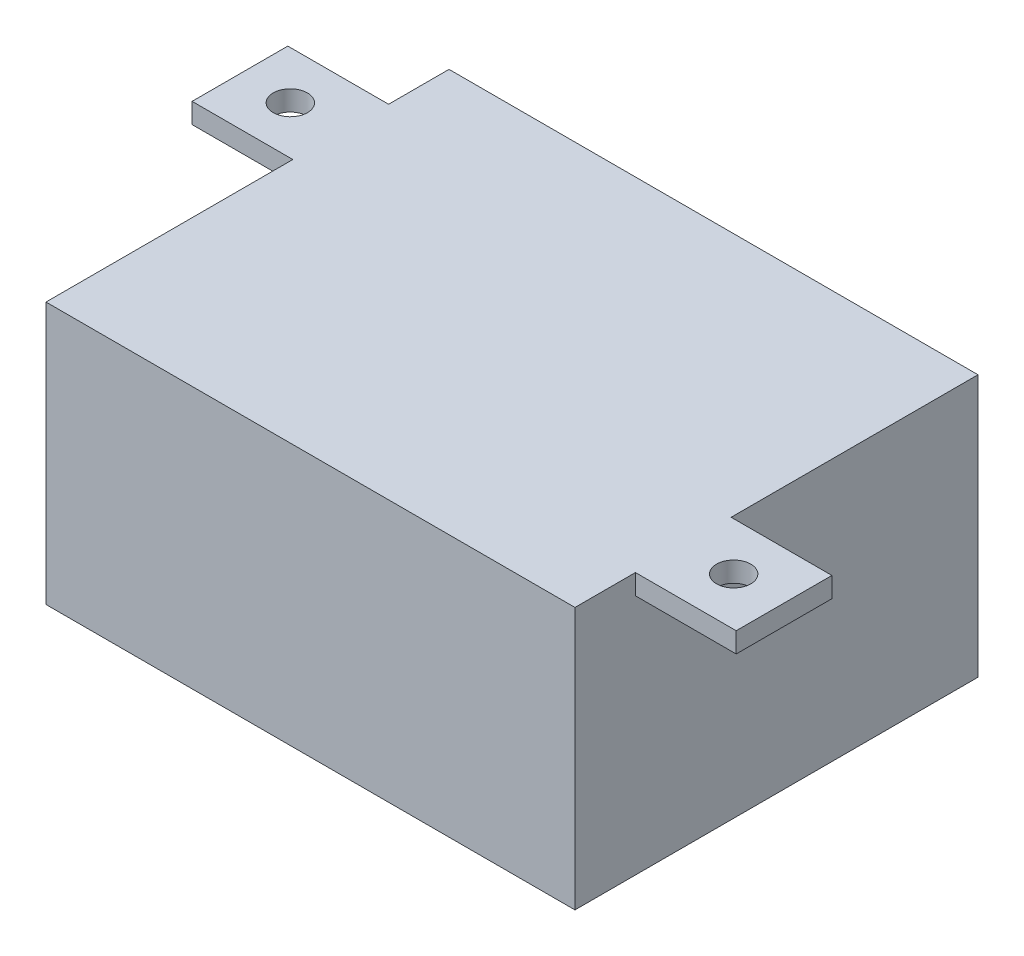
ISO-10303-21;
HEADER;
FILE_DESCRIPTION(('STEP AP214'),'2;1');
FILE_NAME('part.step','',(''),(''),'','','');
FILE_SCHEMA(('AUTOMOTIVE_DESIGN { 1 0 10303 214 1 1 1 1 }'));
ENDSEC;
DATA;
#1=APPLICATION_CONTEXT('core data for automotive mechanical design processes');
#2=APPLICATION_PROTOCOL_DEFINITION('international standard','automotive_design',2000,#1);
#3=PRODUCT_CONTEXT('',#1,'mechanical');
#4=PRODUCT('Part','Part','',(#3));
#5=PRODUCT_RELATED_PRODUCT_CATEGORY('part','',(#4));
#6=PRODUCT_DEFINITION_FORMATION('','',#4);
#7=PRODUCT_DEFINITION_CONTEXT('part definition',#1,'design');
#8=PRODUCT_DEFINITION('design','',#6,#7);
#9=PRODUCT_DEFINITION_SHAPE('','',#8);
#10=(LENGTH_UNIT() NAMED_UNIT(*) SI_UNIT(.MILLI.,.METRE.));
#11=(NAMED_UNIT(*) PLANE_ANGLE_UNIT() SI_UNIT($,.RADIAN.));
#12=(NAMED_UNIT(*) SI_UNIT($,.STERADIAN.) SOLID_ANGLE_UNIT());
#13=UNCERTAINTY_MEASURE_WITH_UNIT(LENGTH_MEASURE(1.E-05),#10,'distance_accuracy_value','');
#14=(GEOMETRIC_REPRESENTATION_CONTEXT(3) GLOBAL_UNCERTAINTY_ASSIGNED_CONTEXT((#13)) GLOBAL_UNIT_ASSIGNED_CONTEXT((#10,
#11,#12)) REPRESENTATION_CONTEXT('',''));
#15=CARTESIAN_POINT('',(0.,0.,0.));
#16=DIRECTION('',(0.,0.,1.));
#17=DIRECTION('',(1.,0.,0.));
#18=AXIS2_PLACEMENT_3D('',#15,#16,#17);
#19=CARTESIAN_POINT('',(-26.25,92.57,20.));
#20=DIRECTION('',(1.,0.,0.));
#21=DIRECTION('',(0.,0.,-1.));
#22=AXIS2_PLACEMENT_3D('',#19,#20,#21);
#23=PLANE('',#22);
#24=DIRECTION('',(0.,-1.,0.));
#25=VECTOR('',#24,1.);
#26=CARTESIAN_POINT('',(-26.25,92.57,-14.));
#27=LINE('',#26,#25);
#28=CARTESIAN_POINT('',(-26.25,92.57,-14.));
#29=VERTEX_POINT('',#28);
#30=CARTESIAN_POINT('',(-26.25,90.57,-14.));
#31=VERTEX_POINT('',#30);
#32=EDGE_CURVE('E193',#29,#31,#27,.T.);
#33=ORIENTED_EDGE('',*,*,#32,.F.);
#34=DIRECTION('',(0.,0.,1.));
#35=VECTOR('',#34,1.);
#36=CARTESIAN_POINT('',(-26.25,92.57,20.));
#37=LINE('',#36,#35);
#38=CARTESIAN_POINT('',(-26.25,92.57,-20.));
#39=VERTEX_POINT('',#38);
#40=EDGE_CURVE('E194',#39,#29,#37,.T.);
#41=ORIENTED_EDGE('',*,*,#40,.F.);
#42=DIRECTION('',(0.,-1.,0.));
#43=VECTOR('',#42,1.);
#44=CARTESIAN_POINT('',(-26.25,92.57,-20.));
#45=LINE('',#44,#43);
#46=CARTESIAN_POINT('',(-26.25,66.57,-20.));
#47=VERTEX_POINT('',#46);
#48=EDGE_CURVE('E159',#39,#47,#45,.T.);
#49=ORIENTED_EDGE('',*,*,#48,.T.);
#50=DIRECTION('',(0.,0.,1.));
#51=VECTOR('',#50,1.);
#52=CARTESIAN_POINT('',(-26.25,66.57,20.));
#53=LINE('',#52,#51);
#54=CARTESIAN_POINT('',(-26.25,66.57,20.));
#55=VERTEX_POINT('',#54);
#56=EDGE_CURVE('E149',#47,#55,#53,.T.);
#57=ORIENTED_EDGE('',*,*,#56,.T.);
#58=DIRECTION('',(0.,-1.,0.));
#59=VECTOR('',#58,1.);
#60=CARTESIAN_POINT('',(-26.25,92.57,20.));
#61=LINE('',#60,#59);
#62=CARTESIAN_POINT('',(-26.25,92.57,20.));
#63=VERTEX_POINT('',#62);
#64=EDGE_CURVE('E11',#63,#55,#61,.T.);
#65=ORIENTED_EDGE('',*,*,#64,.F.);
#66=CARTESIAN_POINT('',(-26.25,92.57,-4.5));
#67=VERTEX_POINT('',#66);
#68=EDGE_CURVE('E175',#67,#63,#37,.T.);
#69=ORIENTED_EDGE('',*,*,#68,.F.);
#70=DIRECTION('',(0.,-1.,0.));
#71=VECTOR('',#70,1.);
#72=CARTESIAN_POINT('',(-26.25,92.57,-4.5));
#73=LINE('',#72,#71);
#74=CARTESIAN_POINT('',(-26.25,90.57,-4.5));
#75=VERTEX_POINT('',#74);
#76=EDGE_CURVE('E225',#67,#75,#73,.T.);
#77=ORIENTED_EDGE('',*,*,#76,.T.);
#78=DIRECTION('',(0.,0.,-1.));
#79=VECTOR('',#78,1.);
#80=CARTESIAN_POINT('',(-26.25,90.57,-14.));
#81=LINE('',#80,#79);
#82=EDGE_CURVE('E54',#75,#31,#81,.T.);
#83=ORIENTED_EDGE('',*,*,#82,.T.);
#84=EDGE_LOOP('',(#33,#41,#49,#57,#65,#69,#77,#83));
#85=FACE_BOUND('',#84,.T.);
#86=ADVANCED_FACE('F41',(#85),#23,.F.);
#87=CARTESIAN_POINT('',(26.25,92.57,-20.));
#88=DIRECTION('',(-1.,0.,0.));
#89=DIRECTION('',(0.,0.,1.));
#90=AXIS2_PLACEMENT_3D('',#87,#88,#89);
#91=PLANE('',#90);
#92=DIRECTION('',(0.,-1.,0.));
#93=VECTOR('',#92,1.);
#94=CARTESIAN_POINT('',(26.25,92.57,14.));
#95=LINE('',#94,#93);
#96=CARTESIAN_POINT('',(26.25,92.57,14.));
#97=VERTEX_POINT('',#96);
#98=CARTESIAN_POINT('',(26.25,90.57,14.));
#99=VERTEX_POINT('',#98);
#100=EDGE_CURVE('E133',#97,#99,#95,.T.);
#101=ORIENTED_EDGE('',*,*,#100,.F.);
#102=DIRECTION('',(0.,0.,-1.));
#103=VECTOR('',#102,1.);
#104=CARTESIAN_POINT('',(26.25,92.57,-20.));
#105=LINE('',#104,#103);
#106=CARTESIAN_POINT('',(26.25,92.57,20.));
#107=VERTEX_POINT('',#106);
#108=EDGE_CURVE('E150',#107,#97,#105,.T.);
#109=ORIENTED_EDGE('',*,*,#108,.F.);
#110=DIRECTION('',(0.,-1.,0.));
#111=VECTOR('',#110,1.);
#112=CARTESIAN_POINT('',(26.25,92.57,20.));
#113=LINE('',#112,#111);
#114=CARTESIAN_POINT('',(26.25,66.57,20.));
#115=VERTEX_POINT('',#114);
#116=EDGE_CURVE('E48',#107,#115,#113,.T.);
#117=ORIENTED_EDGE('',*,*,#116,.T.);
#118=DIRECTION('',(0.,0.,-1.));
#119=VECTOR('',#118,1.);
#120=CARTESIAN_POINT('',(26.25,66.57,-20.));
#121=LINE('',#120,#119);
#122=CARTESIAN_POINT('',(26.25,66.57,-20.));
#123=VERTEX_POINT('',#122);
#124=EDGE_CURVE('E166',#115,#123,#121,.T.);
#125=ORIENTED_EDGE('',*,*,#124,.T.);
#126=DIRECTION('',(0.,-1.,0.));
#127=VECTOR('',#126,1.);
#128=CARTESIAN_POINT('',(26.25,92.57,-20.));
#129=LINE('',#128,#127);
#130=CARTESIAN_POINT('',(26.25,92.57,-20.));
#131=VERTEX_POINT('',#130);
#132=EDGE_CURVE('E176',#131,#123,#129,.T.);
#133=ORIENTED_EDGE('',*,*,#132,.F.);
#134=CARTESIAN_POINT('',(26.25,92.57,4.5));
#135=VERTEX_POINT('',#134);
#136=EDGE_CURVE('E158',#135,#131,#105,.T.);
#137=ORIENTED_EDGE('',*,*,#136,.F.);
#138=DIRECTION('',(0.,-1.,0.));
#139=VECTOR('',#138,1.);
#140=CARTESIAN_POINT('',(26.25,92.57,4.5));
#141=LINE('',#140,#139);
#142=CARTESIAN_POINT('',(26.25,90.57,4.5));
#143=VERTEX_POINT('',#142);
#144=EDGE_CURVE('E232',#135,#143,#141,.T.);
#145=ORIENTED_EDGE('',*,*,#144,.T.);
#146=DIRECTION('',(0.,0.,1.));
#147=VECTOR('',#146,1.);
#148=CARTESIAN_POINT('',(26.25,90.57,14.));
#149=LINE('',#148,#147);
#150=EDGE_CURVE('E65',#143,#99,#149,.T.);
#151=ORIENTED_EDGE('',*,*,#150,.T.);
#152=EDGE_LOOP('',(#101,#109,#117,#125,#133,#137,#145,#151));
#153=FACE_BOUND('',#152,.T.);
#154=ADVANCED_FACE('F144',(#153),#91,.F.);
#155=CARTESIAN_POINT('',(26.25,92.57,20.));
#156=DIRECTION('',(0.,0.,-1.));
#157=DIRECTION('',(-1.,0.,0.));
#158=AXIS2_PLACEMENT_3D('',#155,#156,#157);
#159=PLANE('',#158);
#160=DIRECTION('',(1.,0.,0.));
#161=VECTOR('',#160,1.);
#162=CARTESIAN_POINT('',(26.25,66.57,20.));
#163=LINE('',#162,#161);
#164=EDGE_CURVE('E170',#55,#115,#163,.T.);
#165=ORIENTED_EDGE('',*,*,#164,.T.);
#166=ORIENTED_EDGE('',*,*,#116,.F.);
#167=DIRECTION('',(1.,0.,0.));
#168=VECTOR('',#167,1.);
#169=CARTESIAN_POINT('',(26.25,92.57,20.));
#170=LINE('',#169,#168);
#171=EDGE_CURVE('E154',#63,#107,#170,.T.);
#172=ORIENTED_EDGE('',*,*,#171,.F.);
#173=ORIENTED_EDGE('',*,*,#64,.T.);
#174=EDGE_LOOP('',(#165,#166,#172,#173));
#175=FACE_BOUND('',#174,.T.);
#176=ADVANCED_FACE('F285',(#175),#159,.F.);
#177=CARTESIAN_POINT('',(-26.25,92.57,-20.));
#178=DIRECTION('',(0.,0.,1.));
#179=DIRECTION('',(1.,0.,0.));
#180=AXIS2_PLACEMENT_3D('',#177,#178,#179);
#181=PLANE('',#180);
#182=DIRECTION('',(-1.,0.,0.));
#183=VECTOR('',#182,1.);
#184=CARTESIAN_POINT('',(-26.25,66.57,-20.));
#185=LINE('',#184,#183);
#186=EDGE_CURVE('E174',#123,#47,#185,.T.);
#187=ORIENTED_EDGE('',*,*,#186,.T.);
#188=ORIENTED_EDGE('',*,*,#48,.F.);
#189=DIRECTION('',(-1.,0.,0.));
#190=VECTOR('',#189,1.);
#191=CARTESIAN_POINT('',(-26.25,92.57,-20.));
#192=LINE('',#191,#190);
#193=EDGE_CURVE('E160',#131,#39,#192,.T.);
#194=ORIENTED_EDGE('',*,*,#193,.F.);
#195=ORIENTED_EDGE('',*,*,#132,.T.);
#196=EDGE_LOOP('',(#187,#188,#194,#195));
#197=FACE_BOUND('',#196,.T.);
#198=ADVANCED_FACE('F186',(#197),#181,.F.);
#199=CARTESIAN_POINT('',(0.,92.57,0.));
#200=DIRECTION('',(0.,-1.,0.));
#201=DIRECTION('',(0.,0.,-1.));
#202=AXIS2_PLACEMENT_3D('',#199,#200,#201);
#203=PLANE('',#202);
#204=ORIENTED_EDGE('',*,*,#40,.T.);
#205=DIRECTION('',(-1.,0.,0.));
#206=VECTOR('',#205,1.);
#207=CARTESIAN_POINT('',(-36.25,92.57,-14.));
#208=LINE('',#207,#206);
#209=CARTESIAN_POINT('',(-36.25,92.57,-14.));
#210=VERTEX_POINT('',#209);
#211=EDGE_CURVE('E209',#29,#210,#208,.T.);
#212=ORIENTED_EDGE('',*,*,#211,.T.);
#213=DIRECTION('',(0.,0.,1.));
#214=VECTOR('',#213,1.);
#215=CARTESIAN_POINT('',(-36.25,92.57,-4.5));
#216=LINE('',#215,#214);
#217=CARTESIAN_POINT('',(-36.25,92.57,-4.5));
#218=VERTEX_POINT('',#217);
#219=EDGE_CURVE('E204',#210,#218,#216,.T.);
#220=ORIENTED_EDGE('',*,*,#219,.T.);
#221=DIRECTION('',(1.,0.,0.));
#222=VECTOR('',#221,1.);
#223=CARTESIAN_POINT('',(-26.25,92.57,-4.5));
#224=LINE('',#223,#222);
#225=EDGE_CURVE('E208',#218,#67,#224,.T.);
#226=ORIENTED_EDGE('',*,*,#225,.T.);
#227=ORIENTED_EDGE('',*,*,#68,.T.);
#228=ORIENTED_EDGE('',*,*,#171,.T.);
#229=ORIENTED_EDGE('',*,*,#108,.T.);
#230=DIRECTION('',(1.,0.,0.));
#231=VECTOR('',#230,1.);
#232=CARTESIAN_POINT('',(36.25,92.57,14.));
#233=LINE('',#232,#231);
#234=CARTESIAN_POINT('',(36.25,92.57,14.));
#235=VERTEX_POINT('',#234);
#236=EDGE_CURVE('E134',#97,#235,#233,.T.);
#237=ORIENTED_EDGE('',*,*,#236,.T.);
#238=DIRECTION('',(0.,0.,-1.));
#239=VECTOR('',#238,1.);
#240=CARTESIAN_POINT('',(36.25,92.57,4.5));
#241=LINE('',#240,#239);
#242=CARTESIAN_POINT('',(36.25,92.57,4.5));
#243=VERTEX_POINT('',#242);
#244=EDGE_CURVE('E140',#235,#243,#241,.T.);
#245=ORIENTED_EDGE('',*,*,#244,.T.);
#246=DIRECTION('',(-1.,0.,0.));
#247=VECTOR('',#246,1.);
#248=CARTESIAN_POINT('',(26.25,92.57,4.5));
#249=LINE('',#248,#247);
#250=EDGE_CURVE('E233',#243,#135,#249,.T.);
#251=ORIENTED_EDGE('',*,*,#250,.T.);
#252=ORIENTED_EDGE('',*,*,#136,.T.);
#253=ORIENTED_EDGE('',*,*,#193,.T.);
#254=EDGE_LOOP('',(#204,#212,#220,#226,#227,#228,#229,#237,#245,#251,#252,#253));
#255=FACE_BOUND('',#254,.T.);
#256=CARTESIAN_POINT('',(31.25,92.57,9.25));
#257=DIRECTION('',(0.,1.,0.));
#258=DIRECTION('',(0.,0.,1.));
#259=AXIS2_PLACEMENT_3D('',#256,#257,#258);
#260=CIRCLE('',#259,1.7);
#261=CARTESIAN_POINT('',(31.25,92.57,10.95));
#262=VERTEX_POINT('',#261);
#263=EDGE_CURVE('E244',#262,#262,#260,.T.);
#264=ORIENTED_EDGE('',*,*,#263,.F.);
#265=EDGE_LOOP('',(#264));
#266=FACE_BOUND('',#265,.T.);
#267=CARTESIAN_POINT('',(-31.25,92.57,-9.25));
#268=DIRECTION('',(0.,1.,0.));
#269=DIRECTION('',(0.,0.,1.));
#270=AXIS2_PLACEMENT_3D('',#267,#268,#269);
#271=CIRCLE('',#270,1.7);
#272=CARTESIAN_POINT('',(-31.25,92.57,-7.55));
#273=VERTEX_POINT('',#272);
#274=EDGE_CURVE('E198',#273,#273,#271,.T.);
#275=ORIENTED_EDGE('',*,*,#274,.F.);
#276=EDGE_LOOP('',(#275));
#277=FACE_BOUND('',#276,.T.);
#278=ADVANCED_FACE('F155',(#255,#266,#277),#203,.F.);
#279=CARTESIAN_POINT('',(0.,66.57,0.));
#280=DIRECTION('',(0.,-1.,0.));
#281=DIRECTION('',(0.,0.,-1.));
#282=AXIS2_PLACEMENT_3D('',#279,#280,#281);
#283=PLANE('',#282);
#284=ORIENTED_EDGE('',*,*,#56,.F.);
#285=ORIENTED_EDGE('',*,*,#186,.F.);
#286=ORIENTED_EDGE('',*,*,#124,.F.);
#287=ORIENTED_EDGE('',*,*,#164,.F.);
#288=EDGE_LOOP('',(#284,#285,#286,#287));
#289=FACE_BOUND('',#288,.T.);
#290=ADVANCED_FACE('F184',(#289),#283,.T.);
#291=CARTESIAN_POINT('',(0.,90.57,0.));
#292=DIRECTION('',(0.,-1.,0.));
#293=DIRECTION('',(0.,0.,-1.));
#294=AXIS2_PLACEMENT_3D('',#291,#292,#293);
#295=PLANE('',#294);
#296=ORIENTED_EDGE('',*,*,#150,.F.);
#297=DIRECTION('',(-1.,0.,0.));
#298=VECTOR('',#297,1.);
#299=CARTESIAN_POINT('',(26.25,90.57,4.5));
#300=LINE('',#299,#298);
#301=CARTESIAN_POINT('',(36.25,90.57,4.5));
#302=VERTEX_POINT('',#301);
#303=EDGE_CURVE('E143',#302,#143,#300,.T.);
#304=ORIENTED_EDGE('',*,*,#303,.F.);
#305=DIRECTION('',(0.,0.,-1.));
#306=VECTOR('',#305,1.);
#307=CARTESIAN_POINT('',(36.25,90.57,4.5));
#308=LINE('',#307,#306);
#309=CARTESIAN_POINT('',(36.25,90.57,14.));
#310=VERTEX_POINT('',#309);
#311=EDGE_CURVE('E237',#310,#302,#308,.T.);
#312=ORIENTED_EDGE('',*,*,#311,.F.);
#313=DIRECTION('',(1.,0.,0.));
#314=VECTOR('',#313,1.);
#315=CARTESIAN_POINT('',(36.25,90.57,14.));
#316=LINE('',#315,#314);
#317=EDGE_CURVE('E236',#99,#310,#316,.T.);
#318=ORIENTED_EDGE('',*,*,#317,.F.);
#319=EDGE_LOOP('',(#296,#304,#312,#318));
#320=FACE_BOUND('',#319,.T.);
#321=CARTESIAN_POINT('',(31.25,90.57,9.25));
#322=DIRECTION('',(0.,1.,0.));
#323=DIRECTION('',(0.,0.,1.));
#324=AXIS2_PLACEMENT_3D('',#321,#322,#323);
#325=CIRCLE('',#324,1.7);
#326=CARTESIAN_POINT('',(31.25,90.57,10.95));
#327=VERTEX_POINT('',#326);
#328=EDGE_CURVE('E201',#327,#327,#325,.T.);
#329=ORIENTED_EDGE('',*,*,#328,.T.);
#330=EDGE_LOOP('',(#329));
#331=FACE_BOUND('',#330,.T.);
#332=ADVANCED_FACE('F292',(#320,#331),#295,.T.);
#333=CARTESIAN_POINT('',(36.25,92.57,14.));
#334=DIRECTION('',(0.,0.,-1.));
#335=DIRECTION('',(-1.,0.,0.));
#336=AXIS2_PLACEMENT_3D('',#333,#334,#335);
#337=PLANE('',#336);
#338=ORIENTED_EDGE('',*,*,#317,.T.);
#339=DIRECTION('',(0.,-1.,0.));
#340=VECTOR('',#339,1.);
#341=CARTESIAN_POINT('',(36.25,92.57,14.));
#342=LINE('',#341,#340);
#343=EDGE_CURVE('E136',#235,#310,#342,.T.);
#344=ORIENTED_EDGE('',*,*,#343,.F.);
#345=ORIENTED_EDGE('',*,*,#236,.F.);
#346=ORIENTED_EDGE('',*,*,#100,.T.);
#347=EDGE_LOOP('',(#338,#344,#345,#346));
#348=FACE_BOUND('',#347,.T.);
#349=ADVANCED_FACE('F135',(#348),#337,.F.);
#350=CARTESIAN_POINT('',(36.25,92.57,4.5));
#351=DIRECTION('',(-1.,0.,0.));
#352=DIRECTION('',(0.,0.,1.));
#353=AXIS2_PLACEMENT_3D('',#350,#351,#352);
#354=PLANE('',#353);
#355=ORIENTED_EDGE('',*,*,#311,.T.);
#356=DIRECTION('',(0.,-1.,0.));
#357=VECTOR('',#356,1.);
#358=CARTESIAN_POINT('',(36.25,92.57,4.5));
#359=LINE('',#358,#357);
#360=EDGE_CURVE('E228',#243,#302,#359,.T.);
#361=ORIENTED_EDGE('',*,*,#360,.F.);
#362=ORIENTED_EDGE('',*,*,#244,.F.);
#363=ORIENTED_EDGE('',*,*,#343,.T.);
#364=EDGE_LOOP('',(#355,#361,#362,#363));
#365=FACE_BOUND('',#364,.T.);
#366=ADVANCED_FACE('F298',(#365),#354,.F.);
#367=CARTESIAN_POINT('',(26.25,92.57,4.5));
#368=DIRECTION('',(0.,0.,1.));
#369=DIRECTION('',(1.,0.,0.));
#370=AXIS2_PLACEMENT_3D('',#367,#368,#369);
#371=PLANE('',#370);
#372=ORIENTED_EDGE('',*,*,#303,.T.);
#373=ORIENTED_EDGE('',*,*,#144,.F.);
#374=ORIENTED_EDGE('',*,*,#250,.F.);
#375=ORIENTED_EDGE('',*,*,#360,.T.);
#376=EDGE_LOOP('',(#372,#373,#374,#375));
#377=FACE_BOUND('',#376,.T.);
#378=ADVANCED_FACE('F273',(#377),#371,.F.);
#379=CARTESIAN_POINT('',(31.25,92.57,9.25));
#380=DIRECTION('',(0.,-1.,0.));
#381=DIRECTION('',(0.,0.,-1.));
#382=AXIS2_PLACEMENT_3D('',#379,#380,#381);
#383=CYLINDRICAL_SURFACE('',#382,1.7);
#384=ORIENTED_EDGE('',*,*,#263,.T.);
#385=EDGE_LOOP('',(#384));
#386=FACE_BOUND('',#385,.T.);
#387=ORIENTED_EDGE('',*,*,#328,.F.);
#388=EDGE_LOOP('',(#387));
#389=FACE_BOUND('',#388,.T.);
#390=ADVANCED_FACE('F248',(#386,#389),#383,.F.);
#391=CARTESIAN_POINT('',(0.,90.57,0.));
#392=DIRECTION('',(0.,-1.,0.));
#393=DIRECTION('',(0.,0.,-1.));
#394=AXIS2_PLACEMENT_3D('',#391,#392,#393);
#395=PLANE('',#394);
#396=DIRECTION('',(0.,0.,1.));
#397=VECTOR('',#396,1.);
#398=CARTESIAN_POINT('',(-36.25,90.57,-4.5));
#399=LINE('',#398,#397);
#400=CARTESIAN_POINT('',(-36.25,90.57,-14.));
#401=VERTEX_POINT('',#400);
#402=CARTESIAN_POINT('',(-36.25,90.57,-4.5));
#403=VERTEX_POINT('',#402);
#404=EDGE_CURVE('E199',#401,#403,#399,.T.);
#405=ORIENTED_EDGE('',*,*,#404,.F.);
#406=DIRECTION('',(-1.,0.,0.));
#407=VECTOR('',#406,1.);
#408=CARTESIAN_POINT('',(-36.25,90.57,-14.));
#409=LINE('',#408,#407);
#410=EDGE_CURVE('E210',#31,#401,#409,.T.);
#411=ORIENTED_EDGE('',*,*,#410,.F.);
#412=ORIENTED_EDGE('',*,*,#82,.F.);
#413=DIRECTION('',(1.,0.,0.));
#414=VECTOR('',#413,1.);
#415=CARTESIAN_POINT('',(-26.25,90.57,-4.5));
#416=LINE('',#415,#414);
#417=EDGE_CURVE('E214',#403,#75,#416,.T.);
#418=ORIENTED_EDGE('',*,*,#417,.F.);
#419=EDGE_LOOP('',(#405,#411,#412,#418));
#420=FACE_BOUND('',#419,.T.);
#421=CARTESIAN_POINT('',(-31.25,90.57,-9.25));
#422=DIRECTION('',(0.,1.,0.));
#423=DIRECTION('',(0.,0.,1.));
#424=AXIS2_PLACEMENT_3D('',#421,#422,#423);
#425=CIRCLE('',#424,1.7);
#426=CARTESIAN_POINT('',(-31.25,90.57,-7.55));
#427=VERTEX_POINT('',#426);
#428=EDGE_CURVE('E200',#427,#427,#425,.T.);
#429=ORIENTED_EDGE('',*,*,#428,.T.);
#430=EDGE_LOOP('',(#429));
#431=FACE_BOUND('',#430,.T.);
#432=ADVANCED_FACE('F263',(#420,#431),#395,.T.);
#433=CARTESIAN_POINT('',(-36.25,92.57,-4.5));
#434=DIRECTION('',(1.,0.,0.));
#435=DIRECTION('',(0.,0.,-1.));
#436=AXIS2_PLACEMENT_3D('',#433,#434,#435);
#437=PLANE('',#436);
#438=ORIENTED_EDGE('',*,*,#404,.T.);
#439=DIRECTION('',(0.,-1.,0.));
#440=VECTOR('',#439,1.);
#441=CARTESIAN_POINT('',(-36.25,92.57,-4.5));
#442=LINE('',#441,#440);
#443=EDGE_CURVE('E223',#218,#403,#442,.T.);
#444=ORIENTED_EDGE('',*,*,#443,.F.);
#445=ORIENTED_EDGE('',*,*,#219,.F.);
#446=DIRECTION('',(0.,-1.,0.));
#447=VECTOR('',#446,1.);
#448=CARTESIAN_POINT('',(-36.25,92.57,-14.));
#449=LINE('',#448,#447);
#450=EDGE_CURVE('E215',#210,#401,#449,.T.);
#451=ORIENTED_EDGE('',*,*,#450,.T.);
#452=EDGE_LOOP('',(#438,#444,#445,#451));
#453=FACE_BOUND('',#452,.T.);
#454=ADVANCED_FACE('F264',(#453),#437,.F.);
#455=CARTESIAN_POINT('',(-26.25,92.57,-4.5));
#456=DIRECTION('',(0.,0.,-1.));
#457=DIRECTION('',(-1.,0.,0.));
#458=AXIS2_PLACEMENT_3D('',#455,#456,#457);
#459=PLANE('',#458);
#460=ORIENTED_EDGE('',*,*,#417,.T.);
#461=ORIENTED_EDGE('',*,*,#76,.F.);
#462=ORIENTED_EDGE('',*,*,#225,.F.);
#463=ORIENTED_EDGE('',*,*,#443,.T.);
#464=EDGE_LOOP('',(#460,#461,#462,#463));
#465=FACE_BOUND('',#464,.T.);
#466=ADVANCED_FACE('F271',(#465),#459,.F.);
#467=CARTESIAN_POINT('',(-36.25,92.57,-14.));
#468=DIRECTION('',(0.,0.,1.));
#469=DIRECTION('',(1.,0.,0.));
#470=AXIS2_PLACEMENT_3D('',#467,#468,#469);
#471=PLANE('',#470);
#472=ORIENTED_EDGE('',*,*,#410,.T.);
#473=ORIENTED_EDGE('',*,*,#450,.F.);
#474=ORIENTED_EDGE('',*,*,#211,.F.);
#475=ORIENTED_EDGE('',*,*,#32,.T.);
#476=EDGE_LOOP('',(#472,#473,#474,#475));
#477=FACE_BOUND('',#476,.T.);
#478=ADVANCED_FACE('F259',(#477),#471,.F.);
#479=CARTESIAN_POINT('',(-31.25,92.57,-9.25));
#480=DIRECTION('',(0.,-1.,0.));
#481=DIRECTION('',(0.,0.,-1.));
#482=AXIS2_PLACEMENT_3D('',#479,#480,#481);
#483=CYLINDRICAL_SURFACE('',#482,1.7);
#484=ORIENTED_EDGE('',*,*,#274,.T.);
#485=EDGE_LOOP('',(#484));
#486=FACE_BOUND('',#485,.T.);
#487=ORIENTED_EDGE('',*,*,#428,.F.);
#488=EDGE_LOOP('',(#487));
#489=FACE_BOUND('',#488,.T.);
#490=ADVANCED_FACE('F258',(#486,#489),#483,.F.);
#491=CLOSED_SHELL('',(#86,#154,#176,#198,#278,#290,#332,#349,#366,#378,#390,#432,#454,#466,#478,#490));
#492=MANIFOLD_SOLID_BREP('B2',#491);
#493=ADVANCED_BREP_SHAPE_REPRESENTATION('',(#18,#492),#14);
#494=SHAPE_DEFINITION_REPRESENTATION(#9,#493);
ENDSEC;
END-ISO-10303-21;
